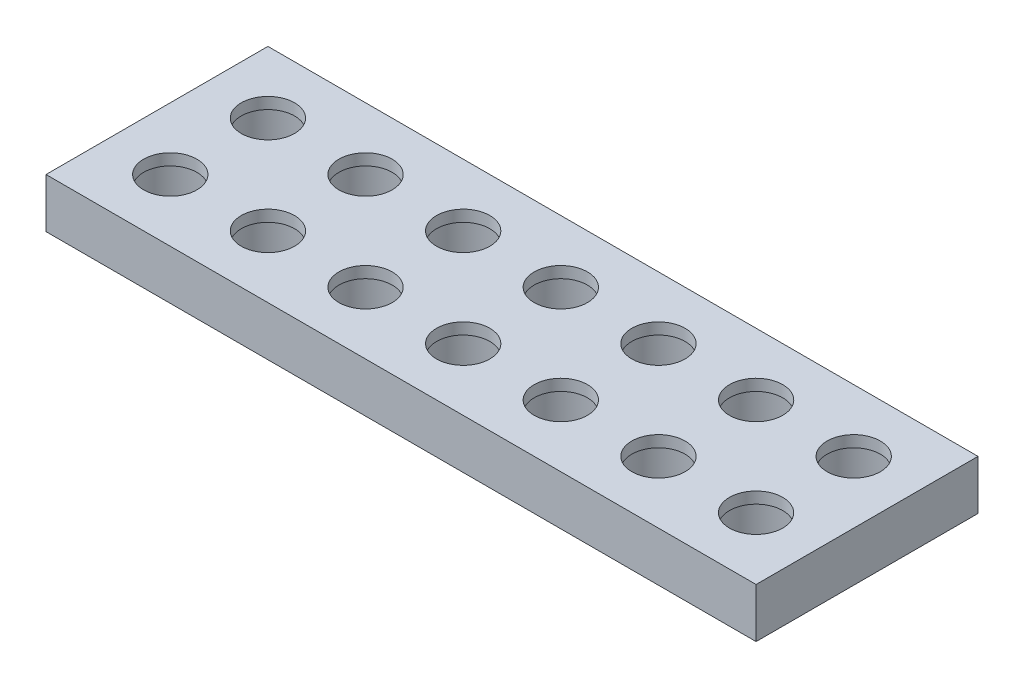
ISO-10303-21;
HEADER;
FILE_DESCRIPTION(('STEP AP214'),'2;1');
FILE_NAME('part.step','',(''),(''),'','','');
FILE_SCHEMA(('AUTOMOTIVE_DESIGN { 1 0 10303 214 1 1 1 1 }'));
ENDSEC;
DATA;
#1=APPLICATION_CONTEXT('core data for automotive mechanical design processes');
#2=APPLICATION_PROTOCOL_DEFINITION('international standard','automotive_design',2000,#1);
#3=PRODUCT_CONTEXT('',#1,'mechanical');
#4=PRODUCT('Part','Part','',(#3));
#5=PRODUCT_RELATED_PRODUCT_CATEGORY('part','',(#4));
#6=PRODUCT_DEFINITION_FORMATION('','',#4);
#7=PRODUCT_DEFINITION_CONTEXT('part definition',#1,'design');
#8=PRODUCT_DEFINITION('design','',#6,#7);
#9=PRODUCT_DEFINITION_SHAPE('','',#8);
#10=(LENGTH_UNIT() NAMED_UNIT(*) SI_UNIT(.MILLI.,.METRE.));
#11=(NAMED_UNIT(*) PLANE_ANGLE_UNIT() SI_UNIT($,.RADIAN.));
#12=(NAMED_UNIT(*) SI_UNIT($,.STERADIAN.) SOLID_ANGLE_UNIT());
#13=UNCERTAINTY_MEASURE_WITH_UNIT(LENGTH_MEASURE(1.E-05),#10,'distance_accuracy_value','');
#14=(GEOMETRIC_REPRESENTATION_CONTEXT(3) GLOBAL_UNCERTAINTY_ASSIGNED_CONTEXT((#13)) GLOBAL_UNIT_ASSIGNED_CONTEXT((#10,
#11,#12)) REPRESENTATION_CONTEXT('',''));
#15=CARTESIAN_POINT('',(0.,0.,0.));
#16=DIRECTION('',(0.,0.,1.));
#17=DIRECTION('',(1.,0.,0.));
#18=AXIS2_PLACEMENT_3D('',#15,#16,#17);
#19=CARTESIAN_POINT('',(170.225,10.,0.));
#20=DIRECTION('',(1.,0.,0.));
#21=DIRECTION('',(0.,0.,-1.));
#22=AXIS2_PLACEMENT_3D('',#19,#20,#21);
#23=PLANE('',#22);
#24=DIRECTION('',(0.,0.,1.));
#25=VECTOR('',#24,1.);
#26=CARTESIAN_POINT('',(170.225,0.,0.));
#27=LINE('',#26,#25);
#28=CARTESIAN_POINT('',(170.225,0.,-41.975));
#29=VERTEX_POINT('',#28);
#30=CARTESIAN_POINT('',(170.225,0.,16.325));
#31=VERTEX_POINT('',#30);
#32=EDGE_CURVE('E87',#29,#31,#27,.T.);
#33=ORIENTED_EDGE('',*,*,#32,.F.);
#34=DIRECTION('',(0.,-1.,0.));
#35=VECTOR('',#34,1.);
#36=CARTESIAN_POINT('',(170.225,10.,-41.975));
#37=LINE('',#36,#35);
#38=CARTESIAN_POINT('',(170.225,13.,-41.975));
#39=VERTEX_POINT('',#38);
#40=EDGE_CURVE('E11',#39,#29,#37,.T.);
#41=ORIENTED_EDGE('',*,*,#40,.F.);
#42=DIRECTION('',(0.,0.,1.));
#43=VECTOR('',#42,1.);
#44=CARTESIAN_POINT('',(170.225,13.,0.));
#45=LINE('',#44,#43);
#46=CARTESIAN_POINT('',(170.225,13.,16.325));
#47=VERTEX_POINT('',#46);
#48=EDGE_CURVE('E86',#39,#47,#45,.T.);
#49=ORIENTED_EDGE('',*,*,#48,.T.);
#50=DIRECTION('',(0.,-1.,0.));
#51=VECTOR('',#50,1.);
#52=CARTESIAN_POINT('',(170.225,10.,16.325));
#53=LINE('',#52,#51);
#54=EDGE_CURVE('E61',#47,#31,#53,.T.);
#55=ORIENTED_EDGE('',*,*,#54,.T.);
#56=EDGE_LOOP('',(#33,#41,#49,#55));
#57=FACE_BOUND('',#56,.T.);
#58=ADVANCED_FACE('F45',(#57),#23,.T.);
#59=CARTESIAN_POINT('',(0.,10.,-41.975));
#60=DIRECTION('',(0.,0.,-1.));
#61=DIRECTION('',(-1.,0.,0.));
#62=AXIS2_PLACEMENT_3D('',#59,#60,#61);
#63=PLANE('',#62);
#64=DIRECTION('',(1.,0.,0.));
#65=VECTOR('',#64,1.);
#66=CARTESIAN_POINT('',(0.,0.,-41.975));
#67=LINE('',#66,#65);
#68=CARTESIAN_POINT('',(-16.325,0.,-41.975));
#69=VERTEX_POINT('',#68);
#70=EDGE_CURVE('E337',#69,#29,#67,.T.);
#71=ORIENTED_EDGE('',*,*,#70,.F.);
#72=DIRECTION('',(0.,-1.,0.));
#73=VECTOR('',#72,1.);
#74=CARTESIAN_POINT('',(-16.325,10.,-41.975));
#75=LINE('',#74,#73);
#76=CARTESIAN_POINT('',(-16.325,13.,-41.975));
#77=VERTEX_POINT('',#76);
#78=EDGE_CURVE('E54',#77,#69,#75,.T.);
#79=ORIENTED_EDGE('',*,*,#78,.F.);
#80=DIRECTION('',(1.,0.,0.));
#81=VECTOR('',#80,1.);
#82=CARTESIAN_POINT('',(0.,13.,-41.975));
#83=LINE('',#82,#81);
#84=EDGE_CURVE('E98',#77,#39,#83,.T.);
#85=ORIENTED_EDGE('',*,*,#84,.T.);
#86=ORIENTED_EDGE('',*,*,#40,.T.);
#87=EDGE_LOOP('',(#71,#79,#85,#86));
#88=FACE_BOUND('',#87,.T.);
#89=ADVANCED_FACE('F104',(#88),#63,.T.);
#90=CARTESIAN_POINT('',(-16.325,10.,0.));
#91=DIRECTION('',(1.,0.,0.));
#92=DIRECTION('',(0.,0.,-1.));
#93=AXIS2_PLACEMENT_3D('',#90,#91,#92);
#94=PLANE('',#93);
#95=DIRECTION('',(0.,0.,1.));
#96=VECTOR('',#95,1.);
#97=CARTESIAN_POINT('',(-16.325,0.,0.));
#98=LINE('',#97,#96);
#99=CARTESIAN_POINT('',(-16.325,0.,16.325));
#100=VERTEX_POINT('',#99);
#101=EDGE_CURVE('E340',#69,#100,#98,.T.);
#102=ORIENTED_EDGE('',*,*,#101,.T.);
#103=DIRECTION('',(0.,-1.,0.));
#104=VECTOR('',#103,1.);
#105=CARTESIAN_POINT('',(-16.325,10.,16.325));
#106=LINE('',#105,#104);
#107=CARTESIAN_POINT('',(-16.325,13.,16.325));
#108=VERTEX_POINT('',#107);
#109=EDGE_CURVE('E348',#108,#100,#106,.T.);
#110=ORIENTED_EDGE('',*,*,#109,.F.);
#111=DIRECTION('',(0.,0.,1.));
#112=VECTOR('',#111,1.);
#113=CARTESIAN_POINT('',(-16.325,13.,0.));
#114=LINE('',#113,#112);
#115=EDGE_CURVE('E107',#77,#108,#114,.T.);
#116=ORIENTED_EDGE('',*,*,#115,.F.);
#117=ORIENTED_EDGE('',*,*,#78,.T.);
#118=EDGE_LOOP('',(#102,#110,#116,#117));
#119=FACE_BOUND('',#118,.T.);
#120=ADVANCED_FACE('F352',(#119),#94,.F.);
#121=CARTESIAN_POINT('',(0.,10.,0.));
#122=DIRECTION('',(0.,-1.,0.));
#123=DIRECTION('',(0.,0.,-1.));
#124=AXIS2_PLACEMENT_3D('',#121,#122,#123);
#125=CYLINDRICAL_SURFACE('',#124,11.325);
#126=CARTESIAN_POINT('',(0.,10.,0.));
#127=DIRECTION('',(0.,1.,0.));
#128=DIRECTION('',(0.,0.,1.));
#129=AXIS2_PLACEMENT_3D('',#126,#127,#128);
#130=CIRCLE('',#129,11.325);
#131=CARTESIAN_POINT('',(0.,10.,11.325));
#132=VERTEX_POINT('',#131);
#133=EDGE_CURVE('E167',#132,#132,#130,.T.);
#134=ORIENTED_EDGE('',*,*,#133,.T.);
#135=EDGE_LOOP('',(#134));
#136=FACE_BOUND('',#135,.T.);
#137=CARTESIAN_POINT('',(0.,0.,0.));
#138=DIRECTION('',(0.,1.,0.));
#139=DIRECTION('',(0.,0.,1.));
#140=AXIS2_PLACEMENT_3D('',#137,#138,#139);
#141=CIRCLE('',#140,11.325);
#142=CARTESIAN_POINT('',(0.,0.,11.325));
#143=VERTEX_POINT('',#142);
#144=EDGE_CURVE('E331',#143,#143,#141,.T.);
#145=ORIENTED_EDGE('',*,*,#144,.F.);
#146=EDGE_LOOP('',(#145));
#147=FACE_BOUND('',#146,.T.);
#148=ADVANCED_FACE('F380',(#136,#147),#125,.F.);
#149=CARTESIAN_POINT('',(25.65,10.,0.));
#150=DIRECTION('',(0.,-1.,0.));
#151=DIRECTION('',(0.,0.,-1.));
#152=AXIS2_PLACEMENT_3D('',#149,#150,#151);
#153=CYLINDRICAL_SURFACE('',#152,11.325);
#154=CARTESIAN_POINT('',(25.65,10.,0.));
#155=DIRECTION('',(0.,1.,0.));
#156=DIRECTION('',(0.,0.,1.));
#157=AXIS2_PLACEMENT_3D('',#154,#155,#156);
#158=CIRCLE('',#157,11.325);
#159=CARTESIAN_POINT('',(25.65,10.,11.325));
#160=VERTEX_POINT('',#159);
#161=EDGE_CURVE('E273',#160,#160,#158,.T.);
#162=ORIENTED_EDGE('',*,*,#161,.T.);
#163=EDGE_LOOP('',(#162));
#164=FACE_BOUND('',#163,.T.);
#165=CARTESIAN_POINT('',(25.65,0.,0.));
#166=DIRECTION('',(0.,1.,0.));
#167=DIRECTION('',(0.,0.,1.));
#168=AXIS2_PLACEMENT_3D('',#165,#166,#167);
#169=CIRCLE('',#168,11.325);
#170=CARTESIAN_POINT('',(25.65,0.,11.325));
#171=VERTEX_POINT('',#170);
#172=EDGE_CURVE('E327',#171,#171,#169,.T.);
#173=ORIENTED_EDGE('',*,*,#172,.F.);
#174=EDGE_LOOP('',(#173));
#175=FACE_BOUND('',#174,.T.);
#176=ADVANCED_FACE('F383',(#164,#175),#153,.F.);
#177=CARTESIAN_POINT('',(51.3,10.,0.));
#178=DIRECTION('',(0.,-1.,0.));
#179=DIRECTION('',(0.,0.,-1.));
#180=AXIS2_PLACEMENT_3D('',#177,#178,#179);
#181=CYLINDRICAL_SURFACE('',#180,11.325);
#182=CARTESIAN_POINT('',(51.3,10.,0.));
#183=DIRECTION('',(0.,1.,0.));
#184=DIRECTION('',(0.,0.,1.));
#185=AXIS2_PLACEMENT_3D('',#182,#183,#184);
#186=CIRCLE('',#185,11.325);
#187=CARTESIAN_POINT('',(51.3,10.,11.325));
#188=VERTEX_POINT('',#187);
#189=EDGE_CURVE('E269',#188,#188,#186,.T.);
#190=ORIENTED_EDGE('',*,*,#189,.T.);
#191=EDGE_LOOP('',(#190));
#192=FACE_BOUND('',#191,.T.);
#193=CARTESIAN_POINT('',(51.3,0.,0.));
#194=DIRECTION('',(0.,1.,0.));
#195=DIRECTION('',(0.,0.,1.));
#196=AXIS2_PLACEMENT_3D('',#193,#194,#195);
#197=CIRCLE('',#196,11.325);
#198=CARTESIAN_POINT('',(51.3,0.,11.325));
#199=VERTEX_POINT('',#198);
#200=EDGE_CURVE('E323',#199,#199,#197,.T.);
#201=ORIENTED_EDGE('',*,*,#200,.F.);
#202=EDGE_LOOP('',(#201));
#203=FACE_BOUND('',#202,.T.);
#204=ADVANCED_FACE('F387',(#192,#203),#181,.F.);
#205=CARTESIAN_POINT('',(76.95,10.,0.));
#206=DIRECTION('',(0.,-1.,0.));
#207=DIRECTION('',(0.,0.,-1.));
#208=AXIS2_PLACEMENT_3D('',#205,#206,#207);
#209=CYLINDRICAL_SURFACE('',#208,11.325);
#210=CARTESIAN_POINT('',(76.95,10.,0.));
#211=DIRECTION('',(0.,1.,0.));
#212=DIRECTION('',(0.,0.,1.));
#213=AXIS2_PLACEMENT_3D('',#210,#211,#212);
#214=CIRCLE('',#213,11.325);
#215=CARTESIAN_POINT('',(76.95,10.,11.325));
#216=VERTEX_POINT('',#215);
#217=EDGE_CURVE('E265',#216,#216,#214,.T.);
#218=ORIENTED_EDGE('',*,*,#217,.T.);
#219=EDGE_LOOP('',(#218));
#220=FACE_BOUND('',#219,.T.);
#221=CARTESIAN_POINT('',(76.95,0.,0.));
#222=DIRECTION('',(0.,1.,0.));
#223=DIRECTION('',(0.,0.,1.));
#224=AXIS2_PLACEMENT_3D('',#221,#222,#223);
#225=CIRCLE('',#224,11.325);
#226=CARTESIAN_POINT('',(76.95,0.,11.325));
#227=VERTEX_POINT('',#226);
#228=EDGE_CURVE('E319',#227,#227,#225,.T.);
#229=ORIENTED_EDGE('',*,*,#228,.F.);
#230=EDGE_LOOP('',(#229));
#231=FACE_BOUND('',#230,.T.);
#232=ADVANCED_FACE('F391',(#220,#231),#209,.F.);
#233=CARTESIAN_POINT('',(102.6,10.,0.));
#234=DIRECTION('',(0.,-1.,0.));
#235=DIRECTION('',(0.,0.,-1.));
#236=AXIS2_PLACEMENT_3D('',#233,#234,#235);
#237=CYLINDRICAL_SURFACE('',#236,11.325);
#238=CARTESIAN_POINT('',(102.6,10.,0.));
#239=DIRECTION('',(0.,1.,0.));
#240=DIRECTION('',(0.,0.,1.));
#241=AXIS2_PLACEMENT_3D('',#238,#239,#240);
#242=CIRCLE('',#241,11.325);
#243=CARTESIAN_POINT('',(102.6,10.,11.325));
#244=VERTEX_POINT('',#243);
#245=EDGE_CURVE('E261',#244,#244,#242,.T.);
#246=ORIENTED_EDGE('',*,*,#245,.T.);
#247=EDGE_LOOP('',(#246));
#248=FACE_BOUND('',#247,.T.);
#249=CARTESIAN_POINT('',(102.6,0.,0.));
#250=DIRECTION('',(0.,1.,0.));
#251=DIRECTION('',(0.,0.,1.));
#252=AXIS2_PLACEMENT_3D('',#249,#250,#251);
#253=CIRCLE('',#252,11.325);
#254=CARTESIAN_POINT('',(102.6,0.,11.325));
#255=VERTEX_POINT('',#254);
#256=EDGE_CURVE('E315',#255,#255,#253,.T.);
#257=ORIENTED_EDGE('',*,*,#256,.F.);
#258=EDGE_LOOP('',(#257));
#259=FACE_BOUND('',#258,.T.);
#260=ADVANCED_FACE('F395',(#248,#259),#237,.F.);
#261=CARTESIAN_POINT('',(128.25,10.,0.));
#262=DIRECTION('',(0.,-1.,0.));
#263=DIRECTION('',(0.,0.,-1.));
#264=AXIS2_PLACEMENT_3D('',#261,#262,#263);
#265=CYLINDRICAL_SURFACE('',#264,11.325);
#266=CARTESIAN_POINT('',(128.25,10.,0.));
#267=DIRECTION('',(0.,1.,0.));
#268=DIRECTION('',(0.,0.,1.));
#269=AXIS2_PLACEMENT_3D('',#266,#267,#268);
#270=CIRCLE('',#269,11.325);
#271=CARTESIAN_POINT('',(128.25,10.,11.325));
#272=VERTEX_POINT('',#271);
#273=EDGE_CURVE('E257',#272,#272,#270,.T.);
#274=ORIENTED_EDGE('',*,*,#273,.T.);
#275=EDGE_LOOP('',(#274));
#276=FACE_BOUND('',#275,.T.);
#277=CARTESIAN_POINT('',(128.25,0.,0.));
#278=DIRECTION('',(0.,1.,0.));
#279=DIRECTION('',(0.,0.,1.));
#280=AXIS2_PLACEMENT_3D('',#277,#278,#279);
#281=CIRCLE('',#280,11.325);
#282=CARTESIAN_POINT('',(128.25,0.,11.325));
#283=VERTEX_POINT('',#282);
#284=EDGE_CURVE('E311',#283,#283,#281,.T.);
#285=ORIENTED_EDGE('',*,*,#284,.F.);
#286=EDGE_LOOP('',(#285));
#287=FACE_BOUND('',#286,.T.);
#288=ADVANCED_FACE('F399',(#276,#287),#265,.F.);
#289=CARTESIAN_POINT('',(153.9,10.,-1.80411241501588E-13));
#290=DIRECTION('',(0.,-1.,0.));
#291=DIRECTION('',(0.,0.,-1.));
#292=AXIS2_PLACEMENT_3D('',#289,#290,#291);
#293=CYLINDRICAL_SURFACE('',#292,11.3249999999998);
#294=CARTESIAN_POINT('',(153.9,10.,-1.80411241501588E-13));
#295=DIRECTION('',(0.,1.,0.));
#296=DIRECTION('',(0.,0.,1.));
#297=AXIS2_PLACEMENT_3D('',#294,#295,#296);
#298=CIRCLE('',#297,11.3249999999998);
#299=CARTESIAN_POINT('',(153.9,10.,11.3249999999996));
#300=VERTEX_POINT('',#299);
#301=EDGE_CURVE('E253',#300,#300,#298,.T.);
#302=ORIENTED_EDGE('',*,*,#301,.T.);
#303=EDGE_LOOP('',(#302));
#304=FACE_BOUND('',#303,.T.);
#305=CARTESIAN_POINT('',(153.9,0.,-1.80411241501588E-13));
#306=DIRECTION('',(0.,1.,0.));
#307=DIRECTION('',(0.,0.,1.));
#308=AXIS2_PLACEMENT_3D('',#305,#306,#307);
#309=CIRCLE('',#308,11.3249999999998);
#310=CARTESIAN_POINT('',(153.9,0.,11.3249999999996));
#311=VERTEX_POINT('',#310);
#312=EDGE_CURVE('E307',#311,#311,#309,.T.);
#313=ORIENTED_EDGE('',*,*,#312,.F.);
#314=EDGE_LOOP('',(#313));
#315=FACE_BOUND('',#314,.T.);
#316=ADVANCED_FACE('F403',(#304,#315),#293,.F.);
#317=CARTESIAN_POINT('',(25.6499999999999,10.,-25.65));
#318=DIRECTION('',(0.,-1.,0.));
#319=DIRECTION('',(0.,0.,-1.));
#320=AXIS2_PLACEMENT_3D('',#317,#318,#319);
#321=CYLINDRICAL_SURFACE('',#320,11.325);
#322=CARTESIAN_POINT('',(25.6499999999999,10.,-25.65));
#323=DIRECTION('',(0.,1.,0.));
#324=DIRECTION('',(0.,0.,1.));
#325=AXIS2_PLACEMENT_3D('',#322,#323,#324);
#326=CIRCLE('',#325,11.325);
#327=CARTESIAN_POINT('',(25.6499999999999,10.,-14.325));
#328=VERTEX_POINT('',#327);
#329=EDGE_CURVE('E249',#328,#328,#326,.T.);
#330=ORIENTED_EDGE('',*,*,#329,.T.);
#331=EDGE_LOOP('',(#330));
#332=FACE_BOUND('',#331,.T.);
#333=CARTESIAN_POINT('',(25.6499999999999,0.,-25.65));
#334=DIRECTION('',(0.,1.,0.));
#335=DIRECTION('',(0.,0.,1.));
#336=AXIS2_PLACEMENT_3D('',#333,#334,#335);
#337=CIRCLE('',#336,11.325);
#338=CARTESIAN_POINT('',(25.6499999999999,0.,-14.325));
#339=VERTEX_POINT('',#338);
#340=EDGE_CURVE('E303',#339,#339,#337,.T.);
#341=ORIENTED_EDGE('',*,*,#340,.F.);
#342=EDGE_LOOP('',(#341));
#343=FACE_BOUND('',#342,.T.);
#344=ADVANCED_FACE('F407',(#332,#343),#321,.F.);
#345=CARTESIAN_POINT('',(51.2999999999999,10.,-25.65));
#346=DIRECTION('',(0.,-1.,0.));
#347=DIRECTION('',(0.,0.,-1.));
#348=AXIS2_PLACEMENT_3D('',#345,#346,#347);
#349=CYLINDRICAL_SURFACE('',#348,11.325);
#350=CARTESIAN_POINT('',(51.2999999999999,10.,-25.65));
#351=DIRECTION('',(0.,1.,0.));
#352=DIRECTION('',(0.,0.,1.));
#353=AXIS2_PLACEMENT_3D('',#350,#351,#352);
#354=CIRCLE('',#353,11.325);
#355=CARTESIAN_POINT('',(51.2999999999999,10.,-14.325));
#356=VERTEX_POINT('',#355);
#357=EDGE_CURVE('E245',#356,#356,#354,.T.);
#358=ORIENTED_EDGE('',*,*,#357,.T.);
#359=EDGE_LOOP('',(#358));
#360=FACE_BOUND('',#359,.T.);
#361=CARTESIAN_POINT('',(51.2999999999999,0.,-25.65));
#362=DIRECTION('',(0.,1.,0.));
#363=DIRECTION('',(0.,0.,1.));
#364=AXIS2_PLACEMENT_3D('',#361,#362,#363);
#365=CIRCLE('',#364,11.325);
#366=CARTESIAN_POINT('',(51.2999999999999,0.,-14.325));
#367=VERTEX_POINT('',#366);
#368=EDGE_CURVE('E299',#367,#367,#365,.T.);
#369=ORIENTED_EDGE('',*,*,#368,.F.);
#370=EDGE_LOOP('',(#369));
#371=FACE_BOUND('',#370,.T.);
#372=ADVANCED_FACE('F411',(#360,#371),#349,.F.);
#373=CARTESIAN_POINT('',(76.9499999999999,10.,-25.65));
#374=DIRECTION('',(0.,-1.,0.));
#375=DIRECTION('',(0.,0.,-1.));
#376=AXIS2_PLACEMENT_3D('',#373,#374,#375);
#377=CYLINDRICAL_SURFACE('',#376,11.325);
#378=CARTESIAN_POINT('',(76.9499999999999,10.,-25.65));
#379=DIRECTION('',(0.,1.,0.));
#380=DIRECTION('',(0.,0.,1.));
#381=AXIS2_PLACEMENT_3D('',#378,#379,#380);
#382=CIRCLE('',#381,11.325);
#383=CARTESIAN_POINT('',(76.9499999999999,10.,-14.325));
#384=VERTEX_POINT('',#383);
#385=EDGE_CURVE('E241',#384,#384,#382,.T.);
#386=ORIENTED_EDGE('',*,*,#385,.T.);
#387=EDGE_LOOP('',(#386));
#388=FACE_BOUND('',#387,.T.);
#389=CARTESIAN_POINT('',(76.9499999999999,0.,-25.65));
#390=DIRECTION('',(0.,1.,0.));
#391=DIRECTION('',(0.,0.,1.));
#392=AXIS2_PLACEMENT_3D('',#389,#390,#391);
#393=CIRCLE('',#392,11.325);
#394=CARTESIAN_POINT('',(76.9499999999999,0.,-14.325));
#395=VERTEX_POINT('',#394);
#396=EDGE_CURVE('E295',#395,#395,#393,.T.);
#397=ORIENTED_EDGE('',*,*,#396,.F.);
#398=EDGE_LOOP('',(#397));
#399=FACE_BOUND('',#398,.T.);
#400=ADVANCED_FACE('F415',(#388,#399),#377,.F.);
#401=CARTESIAN_POINT('',(102.6,10.,-25.65));
#402=DIRECTION('',(0.,-1.,0.));
#403=DIRECTION('',(0.,0.,-1.));
#404=AXIS2_PLACEMENT_3D('',#401,#402,#403);
#405=CYLINDRICAL_SURFACE('',#404,11.325);
#406=CARTESIAN_POINT('',(102.6,10.,-25.65));
#407=DIRECTION('',(0.,1.,0.));
#408=DIRECTION('',(0.,0.,1.));
#409=AXIS2_PLACEMENT_3D('',#406,#407,#408);
#410=CIRCLE('',#409,11.325);
#411=CARTESIAN_POINT('',(102.6,10.,-14.325));
#412=VERTEX_POINT('',#411);
#413=EDGE_CURVE('E237',#412,#412,#410,.T.);
#414=ORIENTED_EDGE('',*,*,#413,.T.);
#415=EDGE_LOOP('',(#414));
#416=FACE_BOUND('',#415,.T.);
#417=CARTESIAN_POINT('',(102.6,0.,-25.65));
#418=DIRECTION('',(0.,1.,0.));
#419=DIRECTION('',(0.,0.,1.));
#420=AXIS2_PLACEMENT_3D('',#417,#418,#419);
#421=CIRCLE('',#420,11.325);
#422=CARTESIAN_POINT('',(102.6,0.,-14.325));
#423=VERTEX_POINT('',#422);
#424=EDGE_CURVE('E291',#423,#423,#421,.T.);
#425=ORIENTED_EDGE('',*,*,#424,.F.);
#426=EDGE_LOOP('',(#425));
#427=FACE_BOUND('',#426,.T.);
#428=ADVANCED_FACE('F419',(#416,#427),#405,.F.);
#429=CARTESIAN_POINT('',(128.25,10.,-25.65));
#430=DIRECTION('',(0.,-1.,0.));
#431=DIRECTION('',(0.,0.,-1.));
#432=AXIS2_PLACEMENT_3D('',#429,#430,#431);
#433=CYLINDRICAL_SURFACE('',#432,11.3250000000003);
#434=CARTESIAN_POINT('',(128.25,10.,-25.65));
#435=DIRECTION('',(0.,1.,0.));
#436=DIRECTION('',(0.,0.,1.));
#437=AXIS2_PLACEMENT_3D('',#434,#435,#436);
#438=CIRCLE('',#437,11.3250000000003);
#439=CARTESIAN_POINT('',(128.25,10.,-14.3249999999997));
#440=VERTEX_POINT('',#439);
#441=EDGE_CURVE('E233',#440,#440,#438,.T.);
#442=ORIENTED_EDGE('',*,*,#441,.T.);
#443=EDGE_LOOP('',(#442));
#444=FACE_BOUND('',#443,.T.);
#445=CARTESIAN_POINT('',(128.25,0.,-25.65));
#446=DIRECTION('',(0.,1.,0.));
#447=DIRECTION('',(0.,0.,1.));
#448=AXIS2_PLACEMENT_3D('',#445,#446,#447);
#449=CIRCLE('',#448,11.3250000000003);
#450=CARTESIAN_POINT('',(128.25,0.,-14.3249999999997));
#451=VERTEX_POINT('',#450);
#452=EDGE_CURVE('E287',#451,#451,#449,.T.);
#453=ORIENTED_EDGE('',*,*,#452,.F.);
#454=EDGE_LOOP('',(#453));
#455=FACE_BOUND('',#454,.T.);
#456=ADVANCED_FACE('F423',(#444,#455),#433,.F.);
#457=CARTESIAN_POINT('',(153.9,10.,-25.65));
#458=DIRECTION('',(0.,-1.,0.));
#459=DIRECTION('',(0.,0.,-1.));
#460=AXIS2_PLACEMENT_3D('',#457,#458,#459);
#461=CYLINDRICAL_SURFACE('',#460,11.325);
#462=CARTESIAN_POINT('',(153.9,10.,-25.65));
#463=DIRECTION('',(0.,1.,0.));
#464=DIRECTION('',(0.,0.,1.));
#465=AXIS2_PLACEMENT_3D('',#462,#463,#464);
#466=CIRCLE('',#465,11.325);
#467=CARTESIAN_POINT('',(153.9,10.,-14.325));
#468=VERTEX_POINT('',#467);
#469=EDGE_CURVE('E229',#468,#468,#466,.T.);
#470=ORIENTED_EDGE('',*,*,#469,.T.);
#471=EDGE_LOOP('',(#470));
#472=FACE_BOUND('',#471,.T.);
#473=CARTESIAN_POINT('',(153.9,0.,-25.65));
#474=DIRECTION('',(0.,1.,0.));
#475=DIRECTION('',(0.,0.,1.));
#476=AXIS2_PLACEMENT_3D('',#473,#474,#475);
#477=CIRCLE('',#476,11.325);
#478=CARTESIAN_POINT('',(153.9,0.,-14.325));
#479=VERTEX_POINT('',#478);
#480=EDGE_CURVE('E283',#479,#479,#477,.T.);
#481=ORIENTED_EDGE('',*,*,#480,.F.);
#482=EDGE_LOOP('',(#481));
#483=FACE_BOUND('',#482,.T.);
#484=ADVANCED_FACE('F426',(#472,#483),#461,.F.);
#485=CARTESIAN_POINT('',(0.,10.,-25.65));
#486=DIRECTION('',(0.,-1.,0.));
#487=DIRECTION('',(0.,0.,-1.));
#488=AXIS2_PLACEMENT_3D('',#485,#486,#487);
#489=CYLINDRICAL_SURFACE('',#488,11.325);
#490=CARTESIAN_POINT('',(0.,10.,-25.65));
#491=DIRECTION('',(0.,1.,0.));
#492=DIRECTION('',(0.,0.,1.));
#493=AXIS2_PLACEMENT_3D('',#490,#491,#492);
#494=CIRCLE('',#493,11.325);
#495=CARTESIAN_POINT('',(0.,10.,-14.325));
#496=VERTEX_POINT('',#495);
#497=EDGE_CURVE('E224',#496,#496,#494,.T.);
#498=ORIENTED_EDGE('',*,*,#497,.T.);
#499=EDGE_LOOP('',(#498));
#500=FACE_BOUND('',#499,.T.);
#501=CARTESIAN_POINT('',(0.,0.,-25.65));
#502=DIRECTION('',(0.,1.,0.));
#503=DIRECTION('',(0.,0.,1.));
#504=AXIS2_PLACEMENT_3D('',#501,#502,#503);
#505=CIRCLE('',#504,11.325);
#506=CARTESIAN_POINT('',(0.,0.,-14.325));
#507=VERTEX_POINT('',#506);
#508=EDGE_CURVE('E228',#507,#507,#505,.T.);
#509=ORIENTED_EDGE('',*,*,#508,.F.);
#510=EDGE_LOOP('',(#509));
#511=FACE_BOUND('',#510,.T.);
#512=ADVANCED_FACE('F47',(#500,#511),#489,.F.);
#513=CARTESIAN_POINT('',(0.,10.,16.325));
#514=DIRECTION('',(0.,0.,-1.));
#515=DIRECTION('',(-1.,0.,0.));
#516=AXIS2_PLACEMENT_3D('',#513,#514,#515);
#517=PLANE('',#516);
#518=DIRECTION('',(1.,0.,0.));
#519=VECTOR('',#518,1.);
#520=CARTESIAN_POINT('',(0.,0.,16.325));
#521=LINE('',#520,#519);
#522=EDGE_CURVE('E68',#100,#31,#521,.T.);
#523=ORIENTED_EDGE('',*,*,#522,.T.);
#524=ORIENTED_EDGE('',*,*,#54,.F.);
#525=DIRECTION('',(1.,0.,0.));
#526=VECTOR('',#525,1.);
#527=CARTESIAN_POINT('',(0.,13.,16.325));
#528=LINE('',#527,#526);
#529=EDGE_CURVE('E100',#108,#47,#528,.T.);
#530=ORIENTED_EDGE('',*,*,#529,.F.);
#531=ORIENTED_EDGE('',*,*,#109,.T.);
#532=EDGE_LOOP('',(#523,#524,#530,#531));
#533=FACE_BOUND('',#532,.T.);
#534=ADVANCED_FACE('F356',(#533),#517,.F.);
#535=CARTESIAN_POINT('',(0.,0.,0.));
#536=DIRECTION('',(0.,1.,0.));
#537=DIRECTION('',(0.,0.,1.));
#538=AXIS2_PLACEMENT_3D('',#535,#536,#537);
#539=PLANE('',#538);
#540=ORIENTED_EDGE('',*,*,#508,.T.);
#541=EDGE_LOOP('',(#540));
#542=FACE_BOUND('',#541,.T.);
#543=ORIENTED_EDGE('',*,*,#480,.T.);
#544=EDGE_LOOP('',(#543));
#545=FACE_BOUND('',#544,.T.);
#546=ORIENTED_EDGE('',*,*,#452,.T.);
#547=EDGE_LOOP('',(#546));
#548=FACE_BOUND('',#547,.T.);
#549=ORIENTED_EDGE('',*,*,#424,.T.);
#550=EDGE_LOOP('',(#549));
#551=FACE_BOUND('',#550,.T.);
#552=ORIENTED_EDGE('',*,*,#396,.T.);
#553=EDGE_LOOP('',(#552));
#554=FACE_BOUND('',#553,.T.);
#555=ORIENTED_EDGE('',*,*,#368,.T.);
#556=EDGE_LOOP('',(#555));
#557=FACE_BOUND('',#556,.T.);
#558=ORIENTED_EDGE('',*,*,#340,.T.);
#559=EDGE_LOOP('',(#558));
#560=FACE_BOUND('',#559,.T.);
#561=ORIENTED_EDGE('',*,*,#312,.T.);
#562=EDGE_LOOP('',(#561));
#563=FACE_BOUND('',#562,.T.);
#564=ORIENTED_EDGE('',*,*,#284,.T.);
#565=EDGE_LOOP('',(#564));
#566=FACE_BOUND('',#565,.T.);
#567=ORIENTED_EDGE('',*,*,#256,.T.);
#568=EDGE_LOOP('',(#567));
#569=FACE_BOUND('',#568,.T.);
#570=ORIENTED_EDGE('',*,*,#228,.T.);
#571=EDGE_LOOP('',(#570));
#572=FACE_BOUND('',#571,.T.);
#573=ORIENTED_EDGE('',*,*,#200,.T.);
#574=EDGE_LOOP('',(#573));
#575=FACE_BOUND('',#574,.T.);
#576=ORIENTED_EDGE('',*,*,#172,.T.);
#577=EDGE_LOOP('',(#576));
#578=FACE_BOUND('',#577,.T.);
#579=ORIENTED_EDGE('',*,*,#144,.T.);
#580=EDGE_LOOP('',(#579));
#581=FACE_BOUND('',#580,.T.);
#582=ORIENTED_EDGE('',*,*,#32,.T.);
#583=ORIENTED_EDGE('',*,*,#522,.F.);
#584=ORIENTED_EDGE('',*,*,#101,.F.);
#585=ORIENTED_EDGE('',*,*,#70,.T.);
#586=EDGE_LOOP('',(#582,#583,#584,#585));
#587=FACE_BOUND('',#586,.T.);
#588=ADVANCED_FACE('F353',(#542,#545,#548,#551,#554,#557,#560,#563,#566,#569,#572,#575,#578,
#581,#587),#539,.F.);
#589=CARTESIAN_POINT('',(0.,10.,0.));
#590=DIRECTION('',(0.,1.,0.));
#591=DIRECTION('',(0.,0.,1.));
#592=AXIS2_PLACEMENT_3D('',#589,#590,#591);
#593=PLANE('',#592);
#594=CARTESIAN_POINT('',(-1.08246744900953E-12,10.,-25.6499999999989));
#595=DIRECTION('',(0.,1.,0.));
#596=DIRECTION('',(0.,0.,1.));
#597=AXIS2_PLACEMENT_3D('',#594,#595,#596);
#598=CIRCLE('',#597,7.00000000000002);
#599=CARTESIAN_POINT('',(-1.08246744900953E-12,10.,-18.6499999999989));
#600=VERTEX_POINT('',#599);
#601=EDGE_CURVE('E168',#600,#600,#598,.T.);
#602=ORIENTED_EDGE('',*,*,#601,.T.);
#603=EDGE_LOOP('',(#602));
#604=FACE_BOUND('',#603,.T.);
#605=ORIENTED_EDGE('',*,*,#497,.F.);
#606=EDGE_LOOP('',(#605));
#607=FACE_BOUND('',#606,.T.);
#608=ADVANCED_FACE('F355',(#604,#607),#593,.F.);
#609=CARTESIAN_POINT('',(153.9,10.,-25.65));
#610=DIRECTION('',(0.,1.,0.));
#611=DIRECTION('',(0.,0.,1.));
#612=AXIS2_PLACEMENT_3D('',#609,#610,#611);
#613=CIRCLE('',#612,7.00000000000001);
#614=CARTESIAN_POINT('',(153.9,10.,-18.65));
#615=VERTEX_POINT('',#614);
#616=EDGE_CURVE('E220',#615,#615,#613,.T.);
#617=ORIENTED_EDGE('',*,*,#616,.T.);
#618=EDGE_LOOP('',(#617));
#619=FACE_BOUND('',#618,.T.);
#620=ORIENTED_EDGE('',*,*,#469,.F.);
#621=EDGE_LOOP('',(#620));
#622=FACE_BOUND('',#621,.T.);
#623=ADVANCED_FACE('F364',(#619,#622),#593,.F.);
#624=CARTESIAN_POINT('',(128.25,10.,-25.6499999999998));
#625=DIRECTION('',(0.,1.,0.));
#626=DIRECTION('',(0.,0.,1.));
#627=AXIS2_PLACEMENT_3D('',#624,#625,#626);
#628=CIRCLE('',#627,7.00000000000001);
#629=CARTESIAN_POINT('',(128.25,10.,-18.6499999999998));
#630=VERTEX_POINT('',#629);
#631=EDGE_CURVE('E216',#630,#630,#628,.T.);
#632=ORIENTED_EDGE('',*,*,#631,.T.);
#633=EDGE_LOOP('',(#632));
#634=FACE_BOUND('',#633,.T.);
#635=ORIENTED_EDGE('',*,*,#441,.F.);
#636=EDGE_LOOP('',(#635));
#637=FACE_BOUND('',#636,.T.);
#638=ADVANCED_FACE('F474',(#634,#637),#593,.F.);
#639=CARTESIAN_POINT('',(102.6,10.,-25.6499999999996));
#640=DIRECTION('',(0.,1.,0.));
#641=DIRECTION('',(0.,0.,1.));
#642=AXIS2_PLACEMENT_3D('',#639,#640,#641);
#643=CIRCLE('',#642,7.00000000000002);
#644=CARTESIAN_POINT('',(102.6,10.,-18.6499999999996));
#645=VERTEX_POINT('',#644);
#646=EDGE_CURVE('E212',#645,#645,#643,.T.);
#647=ORIENTED_EDGE('',*,*,#646,.T.);
#648=EDGE_LOOP('',(#647));
#649=FACE_BOUND('',#648,.T.);
#650=ORIENTED_EDGE('',*,*,#413,.F.);
#651=EDGE_LOOP('',(#650));
#652=FACE_BOUND('',#651,.T.);
#653=ADVANCED_FACE('F479',(#649,#652),#593,.F.);
#654=CARTESIAN_POINT('',(76.9499999999994,10.,-25.6499999999995));
#655=DIRECTION('',(0.,1.,0.));
#656=DIRECTION('',(0.,0.,1.));
#657=AXIS2_PLACEMENT_3D('',#654,#655,#656);
#658=CIRCLE('',#657,7.00000000000002);
#659=CARTESIAN_POINT('',(76.9499999999994,10.,-18.6499999999994));
#660=VERTEX_POINT('',#659);
#661=EDGE_CURVE('E208',#660,#660,#658,.T.);
#662=ORIENTED_EDGE('',*,*,#661,.T.);
#663=EDGE_LOOP('',(#662));
#664=FACE_BOUND('',#663,.T.);
#665=ORIENTED_EDGE('',*,*,#385,.F.);
#666=EDGE_LOOP('',(#665));
#667=FACE_BOUND('',#666,.T.);
#668=ADVANCED_FACE('F759',(#664,#667),#593,.F.);
#669=CARTESIAN_POINT('',(51.2999999999993,10.,-25.6499999999993));
#670=DIRECTION('',(0.,1.,0.));
#671=DIRECTION('',(0.,0.,1.));
#672=AXIS2_PLACEMENT_3D('',#669,#670,#671);
#673=CIRCLE('',#672,7.00000000000001);
#674=CARTESIAN_POINT('',(51.2999999999993,10.,-18.6499999999993));
#675=VERTEX_POINT('',#674);
#676=EDGE_CURVE('E204',#675,#675,#673,.T.);
#677=ORIENTED_EDGE('',*,*,#676,.T.);
#678=EDGE_LOOP('',(#677));
#679=FACE_BOUND('',#678,.T.);
#680=ORIENTED_EDGE('',*,*,#357,.F.);
#681=EDGE_LOOP('',(#680));
#682=FACE_BOUND('',#681,.T.);
#683=ADVANCED_FACE('F750',(#679,#682),#593,.F.);
#684=CARTESIAN_POINT('',(25.6499999999991,10.,-25.6499999999991));
#685=DIRECTION('',(0.,1.,0.));
#686=DIRECTION('',(0.,0.,1.));
#687=AXIS2_PLACEMENT_3D('',#684,#685,#686);
#688=CIRCLE('',#687,7.00000000000002);
#689=CARTESIAN_POINT('',(25.6499999999991,10.,-18.6499999999991));
#690=VERTEX_POINT('',#689);
#691=EDGE_CURVE('E200',#690,#690,#688,.T.);
#692=ORIENTED_EDGE('',*,*,#691,.T.);
#693=EDGE_LOOP('',(#692));
#694=FACE_BOUND('',#693,.T.);
#695=ORIENTED_EDGE('',*,*,#329,.F.);
#696=EDGE_LOOP('',(#695));
#697=FACE_BOUND('',#696,.T.);
#698=ADVANCED_FACE('F741',(#694,#697),#593,.F.);
#699=CARTESIAN_POINT('',(153.9,10.,-1.80411241501588E-13));
#700=DIRECTION('',(0.,1.,0.));
#701=DIRECTION('',(0.,0.,1.));
#702=AXIS2_PLACEMENT_3D('',#699,#700,#701);
#703=CIRCLE('',#702,7.00000000000001);
#704=CARTESIAN_POINT('',(153.9,10.,6.99999999999983));
#705=VERTEX_POINT('',#704);
#706=EDGE_CURVE('E196',#705,#705,#703,.T.);
#707=ORIENTED_EDGE('',*,*,#706,.T.);
#708=EDGE_LOOP('',(#707));
#709=FACE_BOUND('',#708,.T.);
#710=ORIENTED_EDGE('',*,*,#301,.F.);
#711=EDGE_LOOP('',(#710));
#712=FACE_BOUND('',#711,.T.);
#713=ADVANCED_FACE('F732',(#709,#712),#593,.F.);
#714=CARTESIAN_POINT('',(128.25,10.,0.));
#715=DIRECTION('',(0.,1.,0.));
#716=DIRECTION('',(0.,0.,1.));
#717=AXIS2_PLACEMENT_3D('',#714,#715,#716);
#718=CIRCLE('',#717,7.00000000000001);
#719=CARTESIAN_POINT('',(128.25,10.,7.00000000000001));
#720=VERTEX_POINT('',#719);
#721=EDGE_CURVE('E192',#720,#720,#718,.T.);
#722=ORIENTED_EDGE('',*,*,#721,.T.);
#723=EDGE_LOOP('',(#722));
#724=FACE_BOUND('',#723,.T.);
#725=ORIENTED_EDGE('',*,*,#273,.F.);
#726=EDGE_LOOP('',(#725));
#727=FACE_BOUND('',#726,.T.);
#728=ADVANCED_FACE('F723',(#724,#727),#593,.F.);
#729=CARTESIAN_POINT('',(102.6,10.,1.76941794549634E-13));
#730=DIRECTION('',(0.,1.,0.));
#731=DIRECTION('',(0.,0.,1.));
#732=AXIS2_PLACEMENT_3D('',#729,#730,#731);
#733=CIRCLE('',#732,7.00000000000002);
#734=CARTESIAN_POINT('',(102.6,10.,7.00000000000019));
#735=VERTEX_POINT('',#734);
#736=EDGE_CURVE('E188',#735,#735,#733,.T.);
#737=ORIENTED_EDGE('',*,*,#736,.T.);
#738=EDGE_LOOP('',(#737));
#739=FACE_BOUND('',#738,.T.);
#740=ORIENTED_EDGE('',*,*,#245,.F.);
#741=EDGE_LOOP('',(#740));
#742=FACE_BOUND('',#741,.T.);
#743=ADVANCED_FACE('F714',(#739,#742),#593,.F.);
#744=CARTESIAN_POINT('',(76.9499999999997,10.,3.57353036051222E-13));
#745=DIRECTION('',(0.,1.,0.));
#746=DIRECTION('',(0.,0.,1.));
#747=AXIS2_PLACEMENT_3D('',#744,#745,#746);
#748=CIRCLE('',#747,7.00000000000002);
#749=CARTESIAN_POINT('',(76.9499999999997,10.,7.00000000000037));
#750=VERTEX_POINT('',#749);
#751=EDGE_CURVE('E184',#750,#750,#748,.T.);
#752=ORIENTED_EDGE('',*,*,#751,.T.);
#753=EDGE_LOOP('',(#752));
#754=FACE_BOUND('',#753,.T.);
#755=ORIENTED_EDGE('',*,*,#217,.F.);
#756=EDGE_LOOP('',(#755));
#757=FACE_BOUND('',#756,.T.);
#758=ADVANCED_FACE('F705',(#754,#757),#593,.F.);
#759=CARTESIAN_POINT('',(51.2999999999995,10.,5.3776427755281E-13));
#760=DIRECTION('',(0.,1.,0.));
#761=DIRECTION('',(0.,0.,1.));
#762=AXIS2_PLACEMENT_3D('',#759,#760,#761);
#763=CIRCLE('',#762,7.00000000000001);
#764=CARTESIAN_POINT('',(51.2999999999995,10.,7.00000000000055));
#765=VERTEX_POINT('',#764);
#766=EDGE_CURVE('E180',#765,#765,#763,.T.);
#767=ORIENTED_EDGE('',*,*,#766,.T.);
#768=EDGE_LOOP('',(#767));
#769=FACE_BOUND('',#768,.T.);
#770=ORIENTED_EDGE('',*,*,#189,.F.);
#771=EDGE_LOOP('',(#770));
#772=FACE_BOUND('',#771,.T.);
#773=ADVANCED_FACE('F696',(#769,#772),#593,.F.);
#774=CARTESIAN_POINT('',(25.6499999999994,10.,7.14706072102445E-13));
#775=DIRECTION('',(0.,1.,0.));
#776=DIRECTION('',(0.,0.,1.));
#777=AXIS2_PLACEMENT_3D('',#774,#775,#776);
#778=CIRCLE('',#777,7.00000000000001);
#779=CARTESIAN_POINT('',(25.6499999999994,10.,7.00000000000073));
#780=VERTEX_POINT('',#779);
#781=EDGE_CURVE('E176',#780,#780,#778,.T.);
#782=ORIENTED_EDGE('',*,*,#781,.T.);
#783=EDGE_LOOP('',(#782));
#784=FACE_BOUND('',#783,.T.);
#785=ORIENTED_EDGE('',*,*,#161,.F.);
#786=EDGE_LOOP('',(#785));
#787=FACE_BOUND('',#786,.T.);
#788=ADVANCED_FACE('F686',(#784,#787),#593,.F.);
#789=CARTESIAN_POINT('',(-8.04911692853238E-13,10.,8.95117313604032E-13));
#790=DIRECTION('',(0.,1.,0.));
#791=DIRECTION('',(0.,0.,1.));
#792=AXIS2_PLACEMENT_3D('',#789,#790,#791);
#793=CIRCLE('',#792,7.00000000000002);
#794=CARTESIAN_POINT('',(-8.04911692853238E-13,10.,7.00000000000091));
#795=VERTEX_POINT('',#794);
#796=EDGE_CURVE('E172',#795,#795,#793,.T.);
#797=ORIENTED_EDGE('',*,*,#796,.T.);
#798=EDGE_LOOP('',(#797));
#799=FACE_BOUND('',#798,.T.);
#800=ORIENTED_EDGE('',*,*,#133,.F.);
#801=EDGE_LOOP('',(#800));
#802=FACE_BOUND('',#801,.T.);
#803=ADVANCED_FACE('F367',(#799,#802),#593,.F.);
#804=CARTESIAN_POINT('',(128.25,13.,-25.6499999999998));
#805=DIRECTION('',(0.,-1.,0.));
#806=DIRECTION('',(0.,0.,-1.));
#807=AXIS2_PLACEMENT_3D('',#804,#805,#806);
#808=CYLINDRICAL_SURFACE('',#807,7.00000000000001);
#809=CARTESIAN_POINT('',(128.25,13.,-25.6499999999998));
#810=DIRECTION('',(0.,1.,0.));
#811=DIRECTION('',(0.,0.,1.));
#812=AXIS2_PLACEMENT_3D('',#809,#810,#811);
#813=CIRCLE('',#812,7.00000000000001);
#814=CARTESIAN_POINT('',(128.25,13.,-18.6499999999998));
#815=VERTEX_POINT('',#814);
#816=EDGE_CURVE('E159',#815,#815,#813,.T.);
#817=ORIENTED_EDGE('',*,*,#816,.T.);
#818=EDGE_LOOP('',(#817));
#819=FACE_BOUND('',#818,.T.);
#820=ORIENTED_EDGE('',*,*,#631,.F.);
#821=EDGE_LOOP('',(#820));
#822=FACE_BOUND('',#821,.T.);
#823=ADVANCED_FACE('F488',(#819,#822),#808,.F.);
#824=CARTESIAN_POINT('',(102.6,13.,-25.6499999999996));
#825=DIRECTION('',(0.,-1.,0.));
#826=DIRECTION('',(0.,0.,-1.));
#827=AXIS2_PLACEMENT_3D('',#824,#825,#826);
#828=CYLINDRICAL_SURFACE('',#827,7.00000000000002);
#829=CARTESIAN_POINT('',(102.6,13.,-25.6499999999996));
#830=DIRECTION('',(0.,1.,0.));
#831=DIRECTION('',(0.,0.,1.));
#832=AXIS2_PLACEMENT_3D('',#829,#830,#831);
#833=CIRCLE('',#832,7.00000000000002);
#834=CARTESIAN_POINT('',(102.6,13.,-18.6499999999996));
#835=VERTEX_POINT('',#834);
#836=EDGE_CURVE('E155',#835,#835,#833,.T.);
#837=ORIENTED_EDGE('',*,*,#836,.T.);
#838=EDGE_LOOP('',(#837));
#839=FACE_BOUND('',#838,.T.);
#840=ORIENTED_EDGE('',*,*,#646,.F.);
#841=EDGE_LOOP('',(#840));
#842=FACE_BOUND('',#841,.T.);
#843=ADVANCED_FACE('F491',(#839,#842),#828,.F.);
#844=CARTESIAN_POINT('',(76.9499999999994,13.,-25.6499999999995));
#845=DIRECTION('',(0.,-1.,0.));
#846=DIRECTION('',(0.,0.,-1.));
#847=AXIS2_PLACEMENT_3D('',#844,#845,#846);
#848=CYLINDRICAL_SURFACE('',#847,7.00000000000002);
#849=CARTESIAN_POINT('',(76.9499999999994,13.,-25.6499999999995));
#850=DIRECTION('',(0.,1.,0.));
#851=DIRECTION('',(0.,0.,1.));
#852=AXIS2_PLACEMENT_3D('',#849,#850,#851);
#853=CIRCLE('',#852,7.00000000000002);
#854=CARTESIAN_POINT('',(76.9499999999994,13.,-18.6499999999994));
#855=VERTEX_POINT('',#854);
#856=EDGE_CURVE('E151',#855,#855,#853,.T.);
#857=ORIENTED_EDGE('',*,*,#856,.T.);
#858=EDGE_LOOP('',(#857));
#859=FACE_BOUND('',#858,.T.);
#860=ORIENTED_EDGE('',*,*,#661,.F.);
#861=EDGE_LOOP('',(#860));
#862=FACE_BOUND('',#861,.T.);
#863=ADVANCED_FACE('F495',(#859,#862),#848,.F.);
#864=CARTESIAN_POINT('',(51.2999999999993,13.,-25.6499999999993));
#865=DIRECTION('',(0.,-1.,0.));
#866=DIRECTION('',(0.,0.,-1.));
#867=AXIS2_PLACEMENT_3D('',#864,#865,#866);
#868=CYLINDRICAL_SURFACE('',#867,7.00000000000001);
#869=CARTESIAN_POINT('',(51.2999999999993,13.,-25.6499999999993));
#870=DIRECTION('',(0.,1.,0.));
#871=DIRECTION('',(0.,0.,1.));
#872=AXIS2_PLACEMENT_3D('',#869,#870,#871);
#873=CIRCLE('',#872,7.00000000000001);
#874=CARTESIAN_POINT('',(51.2999999999993,13.,-18.6499999999993));
#875=VERTEX_POINT('',#874);
#876=EDGE_CURVE('E147',#875,#875,#873,.T.);
#877=ORIENTED_EDGE('',*,*,#876,.T.);
#878=EDGE_LOOP('',(#877));
#879=FACE_BOUND('',#878,.T.);
#880=ORIENTED_EDGE('',*,*,#676,.F.);
#881=EDGE_LOOP('',(#880));
#882=FACE_BOUND('',#881,.T.);
#883=ADVANCED_FACE('F499',(#879,#882),#868,.F.);
#884=CARTESIAN_POINT('',(25.6499999999991,13.,-25.6499999999991));
#885=DIRECTION('',(0.,-1.,0.));
#886=DIRECTION('',(0.,0.,-1.));
#887=AXIS2_PLACEMENT_3D('',#884,#885,#886);
#888=CYLINDRICAL_SURFACE('',#887,7.00000000000002);
#889=CARTESIAN_POINT('',(25.6499999999991,13.,-25.6499999999991));
#890=DIRECTION('',(0.,1.,0.));
#891=DIRECTION('',(0.,0.,1.));
#892=AXIS2_PLACEMENT_3D('',#889,#890,#891);
#893=CIRCLE('',#892,7.00000000000002);
#894=CARTESIAN_POINT('',(25.6499999999991,13.,-18.6499999999991));
#895=VERTEX_POINT('',#894);
#896=EDGE_CURVE('E143',#895,#895,#893,.T.);
#897=ORIENTED_EDGE('',*,*,#896,.T.);
#898=EDGE_LOOP('',(#897));
#899=FACE_BOUND('',#898,.T.);
#900=ORIENTED_EDGE('',*,*,#691,.F.);
#901=EDGE_LOOP('',(#900));
#902=FACE_BOUND('',#901,.T.);
#903=ADVANCED_FACE('F503',(#899,#902),#888,.F.);
#904=CARTESIAN_POINT('',(153.9,13.,-1.80411241501588E-13));
#905=DIRECTION('',(0.,-1.,0.));
#906=DIRECTION('',(0.,0.,-1.));
#907=AXIS2_PLACEMENT_3D('',#904,#905,#906);
#908=CYLINDRICAL_SURFACE('',#907,7.00000000000001);
#909=CARTESIAN_POINT('',(153.9,13.,-1.80411241501588E-13));
#910=DIRECTION('',(0.,1.,0.));
#911=DIRECTION('',(0.,0.,1.));
#912=AXIS2_PLACEMENT_3D('',#909,#910,#911);
#913=CIRCLE('',#912,7.00000000000001);
#914=CARTESIAN_POINT('',(153.9,13.,6.99999999999983));
#915=VERTEX_POINT('',#914);
#916=EDGE_CURVE('E139',#915,#915,#913,.T.);
#917=ORIENTED_EDGE('',*,*,#916,.T.);
#918=EDGE_LOOP('',(#917));
#919=FACE_BOUND('',#918,.T.);
#920=ORIENTED_EDGE('',*,*,#706,.F.);
#921=EDGE_LOOP('',(#920));
#922=FACE_BOUND('',#921,.T.);
#923=ADVANCED_FACE('F507',(#919,#922),#908,.F.);
#924=CARTESIAN_POINT('',(128.25,13.,0.));
#925=DIRECTION('',(0.,-1.,0.));
#926=DIRECTION('',(0.,0.,-1.));
#927=AXIS2_PLACEMENT_3D('',#924,#925,#926);
#928=CYLINDRICAL_SURFACE('',#927,7.00000000000001);
#929=CARTESIAN_POINT('',(128.25,13.,0.));
#930=DIRECTION('',(0.,1.,0.));
#931=DIRECTION('',(0.,0.,1.));
#932=AXIS2_PLACEMENT_3D('',#929,#930,#931);
#933=CIRCLE('',#932,7.00000000000001);
#934=CARTESIAN_POINT('',(128.25,13.,7.00000000000001));
#935=VERTEX_POINT('',#934);
#936=EDGE_CURVE('E135',#935,#935,#933,.T.);
#937=ORIENTED_EDGE('',*,*,#936,.T.);
#938=EDGE_LOOP('',(#937));
#939=FACE_BOUND('',#938,.T.);
#940=ORIENTED_EDGE('',*,*,#721,.F.);
#941=EDGE_LOOP('',(#940));
#942=FACE_BOUND('',#941,.T.);
#943=ADVANCED_FACE('F511',(#939,#942),#928,.F.);
#944=CARTESIAN_POINT('',(102.6,13.,1.76941794549634E-13));
#945=DIRECTION('',(0.,-1.,0.));
#946=DIRECTION('',(0.,0.,-1.));
#947=AXIS2_PLACEMENT_3D('',#944,#945,#946);
#948=CYLINDRICAL_SURFACE('',#947,7.00000000000002);
#949=CARTESIAN_POINT('',(102.6,13.,1.76941794549634E-13));
#950=DIRECTION('',(0.,1.,0.));
#951=DIRECTION('',(0.,0.,1.));
#952=AXIS2_PLACEMENT_3D('',#949,#950,#951);
#953=CIRCLE('',#952,7.00000000000002);
#954=CARTESIAN_POINT('',(102.6,13.,7.00000000000019));
#955=VERTEX_POINT('',#954);
#956=EDGE_CURVE('E131',#955,#955,#953,.T.);
#957=ORIENTED_EDGE('',*,*,#956,.T.);
#958=EDGE_LOOP('',(#957));
#959=FACE_BOUND('',#958,.T.);
#960=ORIENTED_EDGE('',*,*,#736,.F.);
#961=EDGE_LOOP('',(#960));
#962=FACE_BOUND('',#961,.T.);
#963=ADVANCED_FACE('F515',(#959,#962),#948,.F.);
#964=CARTESIAN_POINT('',(76.9499999999997,13.,3.57353036051222E-13));
#965=DIRECTION('',(0.,-1.,0.));
#966=DIRECTION('',(0.,0.,-1.));
#967=AXIS2_PLACEMENT_3D('',#964,#965,#966);
#968=CYLINDRICAL_SURFACE('',#967,7.00000000000002);
#969=CARTESIAN_POINT('',(76.9499999999997,13.,3.57353036051222E-13));
#970=DIRECTION('',(0.,1.,0.));
#971=DIRECTION('',(0.,0.,1.));
#972=AXIS2_PLACEMENT_3D('',#969,#970,#971);
#973=CIRCLE('',#972,7.00000000000002);
#974=CARTESIAN_POINT('',(76.9499999999997,13.,7.00000000000037));
#975=VERTEX_POINT('',#974);
#976=EDGE_CURVE('E127',#975,#975,#973,.T.);
#977=ORIENTED_EDGE('',*,*,#976,.T.);
#978=EDGE_LOOP('',(#977));
#979=FACE_BOUND('',#978,.T.);
#980=ORIENTED_EDGE('',*,*,#751,.F.);
#981=EDGE_LOOP('',(#980));
#982=FACE_BOUND('',#981,.T.);
#983=ADVANCED_FACE('F519',(#979,#982),#968,.F.);
#984=CARTESIAN_POINT('',(51.2999999999995,13.,5.3776427755281E-13));
#985=DIRECTION('',(0.,-1.,0.));
#986=DIRECTION('',(0.,0.,-1.));
#987=AXIS2_PLACEMENT_3D('',#984,#985,#986);
#988=CYLINDRICAL_SURFACE('',#987,7.00000000000001);
#989=CARTESIAN_POINT('',(51.2999999999995,13.,5.3776427755281E-13));
#990=DIRECTION('',(0.,1.,0.));
#991=DIRECTION('',(0.,0.,1.));
#992=AXIS2_PLACEMENT_3D('',#989,#990,#991);
#993=CIRCLE('',#992,7.00000000000001);
#994=CARTESIAN_POINT('',(51.2999999999995,13.,7.00000000000055));
#995=VERTEX_POINT('',#994);
#996=EDGE_CURVE('E123',#995,#995,#993,.T.);
#997=ORIENTED_EDGE('',*,*,#996,.T.);
#998=EDGE_LOOP('',(#997));
#999=FACE_BOUND('',#998,.T.);
#1000=ORIENTED_EDGE('',*,*,#766,.F.);
#1001=EDGE_LOOP('',(#1000));
#1002=FACE_BOUND('',#1001,.T.);
#1003=ADVANCED_FACE('F523',(#999,#1002),#988,.F.);
#1004=CARTESIAN_POINT('',(25.6499999999994,13.,7.14706072102445E-13));
#1005=DIRECTION('',(0.,-1.,0.));
#1006=DIRECTION('',(0.,0.,-1.));
#1007=AXIS2_PLACEMENT_3D('',#1004,#1005,#1006);
#1008=CYLINDRICAL_SURFACE('',#1007,7.00000000000001);
#1009=CARTESIAN_POINT('',(25.6499999999994,13.,7.14706072102445E-13));
#1010=DIRECTION('',(0.,1.,0.));
#1011=DIRECTION('',(0.,0.,1.));
#1012=AXIS2_PLACEMENT_3D('',#1009,#1010,#1011);
#1013=CIRCLE('',#1012,7.00000000000001);
#1014=CARTESIAN_POINT('',(25.6499999999994,13.,7.00000000000073));
#1015=VERTEX_POINT('',#1014);
#1016=EDGE_CURVE('E119',#1015,#1015,#1013,.T.);
#1017=ORIENTED_EDGE('',*,*,#1016,.T.);
#1018=EDGE_LOOP('',(#1017));
#1019=FACE_BOUND('',#1018,.T.);
#1020=ORIENTED_EDGE('',*,*,#781,.F.);
#1021=EDGE_LOOP('',(#1020));
#1022=FACE_BOUND('',#1021,.T.);
#1023=ADVANCED_FACE('F527',(#1019,#1022),#1008,.F.);
#1024=CARTESIAN_POINT('',(-8.04911692853238E-13,13.,8.95117313604032E-13));
#1025=DIRECTION('',(0.,-1.,0.));
#1026=DIRECTION('',(0.,0.,-1.));
#1027=AXIS2_PLACEMENT_3D('',#1024,#1025,#1026);
#1028=CYLINDRICAL_SURFACE('',#1027,7.00000000000002);
#1029=CARTESIAN_POINT('',(-8.04911692853238E-13,13.,8.95117313604032E-13));
#1030=DIRECTION('',(0.,1.,0.));
#1031=DIRECTION('',(0.,0.,1.));
#1032=AXIS2_PLACEMENT_3D('',#1029,#1030,#1031);
#1033=CIRCLE('',#1032,7.00000000000002);
#1034=CARTESIAN_POINT('',(-8.04911692853238E-13,13.,7.00000000000091));
#1035=VERTEX_POINT('',#1034);
#1036=EDGE_CURVE('E115',#1035,#1035,#1033,.T.);
#1037=ORIENTED_EDGE('',*,*,#1036,.T.);
#1038=EDGE_LOOP('',(#1037));
#1039=FACE_BOUND('',#1038,.T.);
#1040=ORIENTED_EDGE('',*,*,#796,.F.);
#1041=EDGE_LOOP('',(#1040));
#1042=FACE_BOUND('',#1041,.T.);
#1043=ADVANCED_FACE('F531',(#1039,#1042),#1028,.F.);
#1044=CARTESIAN_POINT('',(-1.08246744900953E-12,13.,-25.6499999999989));
#1045=DIRECTION('',(0.,-1.,0.));
#1046=DIRECTION('',(0.,0.,-1.));
#1047=AXIS2_PLACEMENT_3D('',#1044,#1045,#1046);
#1048=CYLINDRICAL_SURFACE('',#1047,7.00000000000002);
#1049=CARTESIAN_POINT('',(-1.08246744900953E-12,13.,-25.6499999999989));
#1050=DIRECTION('',(0.,1.,0.));
#1051=DIRECTION('',(0.,0.,1.));
#1052=AXIS2_PLACEMENT_3D('',#1049,#1050,#1051);
#1053=CIRCLE('',#1052,7.00000000000002);
#1054=CARTESIAN_POINT('',(-1.08246744900953E-12,13.,-18.6499999999989));
#1055=VERTEX_POINT('',#1054);
#1056=EDGE_CURVE('E102',#1055,#1055,#1053,.T.);
#1057=ORIENTED_EDGE('',*,*,#1056,.T.);
#1058=EDGE_LOOP('',(#1057));
#1059=FACE_BOUND('',#1058,.T.);
#1060=ORIENTED_EDGE('',*,*,#601,.F.);
#1061=EDGE_LOOP('',(#1060));
#1062=FACE_BOUND('',#1061,.T.);
#1063=ADVANCED_FACE('F486',(#1059,#1062),#1048,.F.);
#1064=CARTESIAN_POINT('',(153.9,13.,-25.65));
#1065=DIRECTION('',(0.,-1.,0.));
#1066=DIRECTION('',(0.,0.,-1.));
#1067=AXIS2_PLACEMENT_3D('',#1064,#1065,#1066);
#1068=CYLINDRICAL_SURFACE('',#1067,7.00000000000001);
#1069=CARTESIAN_POINT('',(153.9,13.,-25.65));
#1070=DIRECTION('',(0.,1.,0.));
#1071=DIRECTION('',(0.,0.,1.));
#1072=AXIS2_PLACEMENT_3D('',#1069,#1070,#1071);
#1073=CIRCLE('',#1072,7.00000000000001);
#1074=CARTESIAN_POINT('',(153.9,13.,-18.65));
#1075=VERTEX_POINT('',#1074);
#1076=EDGE_CURVE('E163',#1075,#1075,#1073,.T.);
#1077=ORIENTED_EDGE('',*,*,#1076,.T.);
#1078=EDGE_LOOP('',(#1077));
#1079=FACE_BOUND('',#1078,.T.);
#1080=ORIENTED_EDGE('',*,*,#616,.F.);
#1081=EDGE_LOOP('',(#1080));
#1082=FACE_BOUND('',#1081,.T.);
#1083=ADVANCED_FACE('F483',(#1079,#1082),#1068,.F.);
#1084=CARTESIAN_POINT('',(0.,13.,0.));
#1085=DIRECTION('',(0.,1.,0.));
#1086=DIRECTION('',(0.,0.,1.));
#1087=AXIS2_PLACEMENT_3D('',#1084,#1085,#1086);
#1088=PLANE('',#1087);
#1089=ORIENTED_EDGE('',*,*,#1056,.F.);
#1090=EDGE_LOOP('',(#1089));
#1091=FACE_BOUND('',#1090,.T.);
#1092=ORIENTED_EDGE('',*,*,#48,.F.);
#1093=ORIENTED_EDGE('',*,*,#84,.F.);
#1094=ORIENTED_EDGE('',*,*,#115,.T.);
#1095=ORIENTED_EDGE('',*,*,#529,.T.);
#1096=EDGE_LOOP('',(#1092,#1093,#1094,#1095));
#1097=FACE_BOUND('',#1096,.T.);
#1098=ORIENTED_EDGE('',*,*,#1036,.F.);
#1099=EDGE_LOOP('',(#1098));
#1100=FACE_BOUND('',#1099,.T.);
#1101=ORIENTED_EDGE('',*,*,#1016,.F.);
#1102=EDGE_LOOP('',(#1101));
#1103=FACE_BOUND('',#1102,.T.);
#1104=ORIENTED_EDGE('',*,*,#996,.F.);
#1105=EDGE_LOOP('',(#1104));
#1106=FACE_BOUND('',#1105,.T.);
#1107=ORIENTED_EDGE('',*,*,#976,.F.);
#1108=EDGE_LOOP('',(#1107));
#1109=FACE_BOUND('',#1108,.T.);
#1110=ORIENTED_EDGE('',*,*,#956,.F.);
#1111=EDGE_LOOP('',(#1110));
#1112=FACE_BOUND('',#1111,.T.);
#1113=ORIENTED_EDGE('',*,*,#936,.F.);
#1114=EDGE_LOOP('',(#1113));
#1115=FACE_BOUND('',#1114,.T.);
#1116=ORIENTED_EDGE('',*,*,#916,.F.);
#1117=EDGE_LOOP('',(#1116));
#1118=FACE_BOUND('',#1117,.T.);
#1119=ORIENTED_EDGE('',*,*,#896,.F.);
#1120=EDGE_LOOP('',(#1119));
#1121=FACE_BOUND('',#1120,.T.);
#1122=ORIENTED_EDGE('',*,*,#876,.F.);
#1123=EDGE_LOOP('',(#1122));
#1124=FACE_BOUND('',#1123,.T.);
#1125=ORIENTED_EDGE('',*,*,#856,.F.);
#1126=EDGE_LOOP('',(#1125));
#1127=FACE_BOUND('',#1126,.T.);
#1128=ORIENTED_EDGE('',*,*,#836,.F.);
#1129=EDGE_LOOP('',(#1128));
#1130=FACE_BOUND('',#1129,.T.);
#1131=ORIENTED_EDGE('',*,*,#816,.F.);
#1132=EDGE_LOOP('',(#1131));
#1133=FACE_BOUND('',#1132,.T.);
#1134=ORIENTED_EDGE('',*,*,#1076,.F.);
#1135=EDGE_LOOP('',(#1134));
#1136=FACE_BOUND('',#1135,.T.);
#1137=ADVANCED_FACE('F95',(#1091,#1097,#1100,#1103,#1106,#1109,#1112,#1115,#1118,#1121,#1124,
#1127,#1130,#1133,#1136),#1088,.T.);
#1138=CLOSED_SHELL('',(#58,#89,#120,#148,#176,#204,#232,#260,#288,#316,#344,#372,#400,#428,#456,
#484,#512,#534,#588,#608,#623,#638,#653,#668,#683,#698,#713,#728,#743,#758,#773,#788,#803,#823,
#843,#863,#883,#903,#923,#943,#963,#983,#1003,#1023,#1043,#1063,#1083,#1137));
#1139=MANIFOLD_SOLID_BREP('B2',#1138);
#1140=ADVANCED_BREP_SHAPE_REPRESENTATION('',(#18,#1139),#14);
#1141=SHAPE_DEFINITION_REPRESENTATION(#9,#1140);
ENDSEC;
END-ISO-10303-21;
